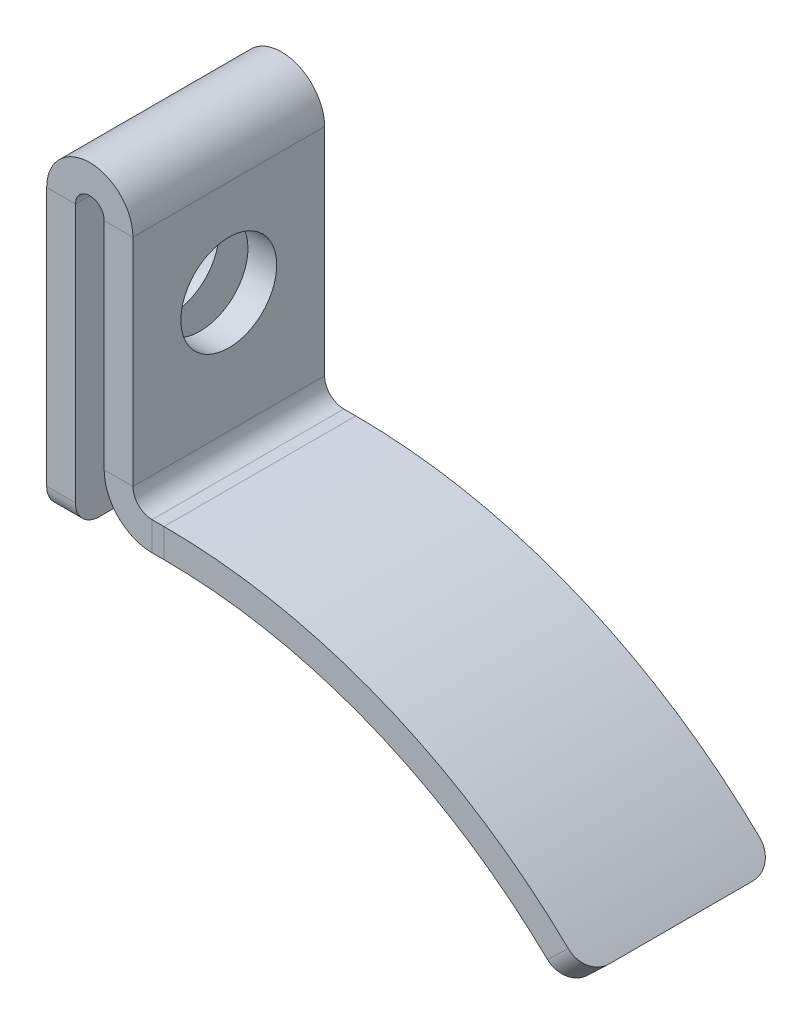
ISO-10303-21;
HEADER;
FILE_DESCRIPTION(('STEP AP214'),'2;1');
FILE_NAME('part.step','',(''),(''),'','','');
FILE_SCHEMA(('AUTOMOTIVE_DESIGN { 1 0 10303 214 1 1 1 1 }'));
ENDSEC;
DATA;
#1=APPLICATION_CONTEXT('core data for automotive mechanical design processes');
#2=APPLICATION_PROTOCOL_DEFINITION('international standard','automotive_design',2000,#1);
#3=PRODUCT_CONTEXT('',#1,'mechanical');
#4=PRODUCT('Part','Part','',(#3));
#5=PRODUCT_RELATED_PRODUCT_CATEGORY('part','',(#4));
#6=PRODUCT_DEFINITION_FORMATION('','',#4);
#7=PRODUCT_DEFINITION_CONTEXT('part definition',#1,'design');
#8=PRODUCT_DEFINITION('design','',#6,#7);
#9=PRODUCT_DEFINITION_SHAPE('','',#8);
#10=(LENGTH_UNIT() NAMED_UNIT(*) SI_UNIT(.MILLI.,.METRE.));
#11=(NAMED_UNIT(*) PLANE_ANGLE_UNIT() SI_UNIT($,.RADIAN.));
#12=(NAMED_UNIT(*) SI_UNIT($,.STERADIAN.) SOLID_ANGLE_UNIT());
#13=UNCERTAINTY_MEASURE_WITH_UNIT(LENGTH_MEASURE(1.E-05),#10,'distance_accuracy_value','');
#14=(GEOMETRIC_REPRESENTATION_CONTEXT(3) GLOBAL_UNCERTAINTY_ASSIGNED_CONTEXT((#13)) GLOBAL_UNIT_ASSIGNED_CONTEXT((#10,
#11,#12)) REPRESENTATION_CONTEXT('',''));
#15=CARTESIAN_POINT('',(0.,0.,0.));
#16=DIRECTION('',(0.,0.,1.));
#17=DIRECTION('',(1.,0.,0.));
#18=AXIS2_PLACEMENT_3D('',#15,#16,#17);
#19=CARTESIAN_POINT('',(1.03626532347582,28.1713062928466,0.85106392317462));
#20=DIRECTION('',(0.,0.,1.));
#21=DIRECTION('',(1.,0.,0.));
#22=AXIS2_PLACEMENT_3D('',#19,#20,#21);
#23=PLANE('',#22);
#24=DIRECTION('',(-1.,0.,0.));
#25=VECTOR('',#24,1.);
#26=CARTESIAN_POINT('',(1.03626532347582,28.1713062928466,0.85106392317462));
#27=LINE('',#26,#25);
#28=CARTESIAN_POINT('',(1.03626532347582,28.1713062928466,0.85106392317462));
#29=VERTEX_POINT('',#28);
#30=CARTESIAN_POINT('',(0.780946174539651,28.1713062928466,0.85106392317462));
#31=VERTEX_POINT('',#30);
#32=EDGE_CURVE('E173',#29,#31,#27,.T.);
#33=ORIENTED_EDGE('',*,*,#32,.F.);
#34=CARTESIAN_POINT('',(1.16392489794391,28.1713062928466,0.85106392317462));
#35=DIRECTION('',(0.,0.,1.));
#36=DIRECTION('',(-1.,0.,0.));
#37=AXIS2_PLACEMENT_3D('',#34,#35,#36);
#38=CIRCLE('',#37,0.127659574468085);
#39=CARTESIAN_POINT('',(1.29158447241199,28.1713062928466,0.85106392317462));
#40=VERTEX_POINT('',#39);
#41=EDGE_CURVE('E176',#40,#29,#38,.T.);
#42=ORIENTED_EDGE('',*,*,#41,.F.);
#43=DIRECTION('',(-1.,0.,0.));
#44=VECTOR('',#43,1.);
#45=CARTESIAN_POINT('',(1.54690362134816,28.1713062928466,0.85106392317462));
#46=LINE('',#45,#44);
#47=CARTESIAN_POINT('',(1.54690362134816,28.1713062928466,0.85106392317462));
#48=VERTEX_POINT('',#47);
#49=EDGE_CURVE('E182',#48,#40,#46,.T.);
#50=ORIENTED_EDGE('',*,*,#49,.F.);
#51=CARTESIAN_POINT('',(1.16392489794391,28.1713062928466,0.85106392317462));
#52=DIRECTION('',(0.,0.,1.));
#53=DIRECTION('',(1.,0.,0.));
#54=AXIS2_PLACEMENT_3D('',#51,#52,#53);
#55=CIRCLE('',#54,0.382978723404255);
#56=EDGE_CURVE('E179',#48,#31,#55,.T.);
#57=ORIENTED_EDGE('',*,*,#56,.T.);
#58=EDGE_LOOP('',(#33,#42,#50,#57));
#59=FACE_BOUND('',#58,.T.);
#60=ADVANCED_FACE('F43',(#59),#23,.T.);
#61=CARTESIAN_POINT('',(1.54690362134816,28.1713062928466,0.85106392317462));
#62=DIRECTION('',(0.,0.,1.));
#63=DIRECTION('',(1.,0.,0.));
#64=AXIS2_PLACEMENT_3D('',#61,#62,#63);
#65=PLANE('',#64);
#66=DIRECTION('',(0.,-1.,0.));
#67=VECTOR('',#66,1.);
#68=CARTESIAN_POINT('',(0.780946174539651,28.1713062928466,0.85106392317462));
#69=LINE('',#68,#67);
#70=CARTESIAN_POINT('',(0.780946174539651,25.8731110371542,0.85106392317462));
#71=VERTEX_POINT('',#70);
#72=EDGE_CURVE('E197',#31,#71,#69,.T.);
#73=ORIENTED_EDGE('',*,*,#72,.T.);
#74=DIRECTION('',(-1.,0.,0.));
#75=VECTOR('',#74,1.);
#76=CARTESIAN_POINT('',(1.54690362134816,25.8731110371542,0.85106392317462));
#77=LINE('',#76,#75);
#78=CARTESIAN_POINT('',(1.03626532347582,25.8731110371542,0.85106392317462));
#79=VERTEX_POINT('',#78);
#80=EDGE_CURVE('E67',#71,#79,#77,.F.);
#81=ORIENTED_EDGE('',*,*,#80,.T.);
#82=DIRECTION('',(0.,-1.,0.));
#83=VECTOR('',#82,1.);
#84=CARTESIAN_POINT('',(1.03626532347582,28.1713062928466,0.85106392317462));
#85=LINE('',#84,#83);
#86=EDGE_CURVE('E187',#29,#79,#85,.T.);
#87=ORIENTED_EDGE('',*,*,#86,.F.);
#88=ORIENTED_EDGE('',*,*,#32,.T.);
#89=EDGE_LOOP('',(#73,#81,#87,#88));
#90=FACE_BOUND('',#89,.T.);
#91=ADVANCED_FACE('F196',(#90),#65,.T.);
#92=CARTESIAN_POINT('',(1.29158447241199,28.1713062928466,-0.851063736399848));
#93=DIRECTION('',(0.,0.,-1.));
#94=DIRECTION('',(-1.,0.,0.));
#95=AXIS2_PLACEMENT_3D('',#92,#93,#94);
#96=PLANE('',#95);
#97=DIRECTION('',(1.,0.,0.));
#98=VECTOR('',#97,1.);
#99=CARTESIAN_POINT('',(1.29158447241199,28.1713062928466,-0.851063736399848));
#100=LINE('',#99,#98);
#101=CARTESIAN_POINT('',(1.29158447241199,28.1713062928466,-0.851063736399848));
#102=VERTEX_POINT('',#101);
#103=CARTESIAN_POINT('',(1.54690362134816,28.1713062928466,-0.851063736399848));
#104=VERTEX_POINT('',#103);
#105=EDGE_CURVE('E310',#102,#104,#100,.T.);
#106=ORIENTED_EDGE('',*,*,#105,.F.);
#107=CARTESIAN_POINT('',(1.16392489794391,28.1713062928466,-0.851063736399848));
#108=DIRECTION('',(0.,0.,1.));
#109=DIRECTION('',(-1.,0.,0.));
#110=AXIS2_PLACEMENT_3D('',#107,#108,#109);
#111=CIRCLE('',#110,0.127659574468085);
#112=CARTESIAN_POINT('',(1.03626532347582,28.1713062928466,-0.851063736399848));
#113=VERTEX_POINT('',#112);
#114=EDGE_CURVE('E233',#102,#113,#111,.T.);
#115=ORIENTED_EDGE('',*,*,#114,.T.);
#116=DIRECTION('',(1.,0.,0.));
#117=VECTOR('',#116,1.);
#118=CARTESIAN_POINT('',(0.780946174539651,28.1713062928466,-0.851063736399848));
#119=LINE('',#118,#117);
#120=CARTESIAN_POINT('',(0.780946174539651,28.1713062928466,-0.851063736399848));
#121=VERTEX_POINT('',#120);
#122=EDGE_CURVE('E308',#121,#113,#119,.T.);
#123=ORIENTED_EDGE('',*,*,#122,.F.);
#124=CARTESIAN_POINT('',(1.16392489794391,28.1713062928466,-0.851063736399848));
#125=DIRECTION('',(0.,0.,1.));
#126=DIRECTION('',(1.,0.,0.));
#127=AXIS2_PLACEMENT_3D('',#124,#125,#126);
#128=CIRCLE('',#127,0.382978723404255);
#129=EDGE_CURVE('E257',#104,#121,#128,.T.);
#130=ORIENTED_EDGE('',*,*,#129,.F.);
#131=EDGE_LOOP('',(#106,#115,#123,#130));
#132=FACE_BOUND('',#131,.T.);
#133=ADVANCED_FACE('F379',(#132),#96,.T.);
#134=CARTESIAN_POINT('',(0.780946174539651,28.1713062928466,-0.851063736399848));
#135=DIRECTION('',(0.,0.,-1.));
#136=DIRECTION('',(-1.,0.,0.));
#137=AXIS2_PLACEMENT_3D('',#134,#135,#136);
#138=PLANE('',#137);
#139=DIRECTION('',(0.,1.,0.));
#140=VECTOR('',#139,1.);
#141=CARTESIAN_POINT('',(1.29158447241199,28.1713062928466,-0.851063736399848));
#142=LINE('',#141,#140);
#143=CARTESIAN_POINT('',(1.29158447241199,26.2547036106091,-0.851063736399848));
#144=VERTEX_POINT('',#143);
#145=EDGE_CURVE('E235',#144,#102,#142,.T.);
#146=ORIENTED_EDGE('',*,*,#145,.T.);
#147=ORIENTED_EDGE('',*,*,#105,.T.);
#148=DIRECTION('',(0.,1.,0.));
#149=VECTOR('',#148,1.);
#150=CARTESIAN_POINT('',(1.54690362134816,28.1713062928466,-0.851063736399848));
#151=LINE('',#150,#149);
#152=CARTESIAN_POINT('',(1.54690362134816,26.2547036106091,-0.851063736399848));
#153=VERTEX_POINT('',#152);
#154=EDGE_CURVE('E254',#153,#104,#151,.T.);
#155=ORIENTED_EDGE('',*,*,#154,.F.);
#156=DIRECTION('',(-1.,0.,0.));
#157=VECTOR('',#156,1.);
#158=CARTESIAN_POINT('',(1.54690362134816,26.2547036106091,-0.851063736399848));
#159=LINE('',#158,#157);
#160=EDGE_CURVE('E300',#153,#144,#159,.T.);
#161=ORIENTED_EDGE('',*,*,#160,.T.);
#162=EDGE_LOOP('',(#146,#147,#155,#161));
#163=FACE_BOUND('',#162,.T.);
#164=ADVANCED_FACE('F384',(#163),#138,.T.);
#165=CARTESIAN_POINT('',(1.29158447241199,26.2547036106091,0.85106392317462));
#166=DIRECTION('',(0.,0.,1.));
#167=DIRECTION('',(1.,0.,0.));
#168=AXIS2_PLACEMENT_3D('',#165,#166,#167);
#169=PLANE('',#168);
#170=DIRECTION('',(1.,0.,0.));
#171=VECTOR('',#170,1.);
#172=CARTESIAN_POINT('',(1.29158447241199,26.2547036106091,0.85106392317462));
#173=LINE('',#172,#171);
#174=CARTESIAN_POINT('',(1.29158447241199,26.2547036106091,0.85106392317462));
#175=VERTEX_POINT('',#174);
#176=CARTESIAN_POINT('',(1.54690362134816,26.2547036106091,0.85106392317462));
#177=VERTEX_POINT('',#176);
#178=EDGE_CURVE('E306',#175,#177,#173,.T.);
#179=ORIENTED_EDGE('',*,*,#178,.F.);
#180=CARTESIAN_POINT('',(1.71711638730561,26.2547036106091,0.85106392317462));
#181=DIRECTION('',(0.,0.,-1.));
#182=DIRECTION('',(-1.,0.,0.));
#183=AXIS2_PLACEMENT_3D('',#180,#181,#182);
#184=CIRCLE('',#183,0.425531914893617);
#185=CARTESIAN_POINT('',(1.71711638730561,25.8291716957155,0.85106392317462));
#186=VERTEX_POINT('',#185);
#187=EDGE_CURVE('E204',#186,#175,#184,.T.);
#188=ORIENTED_EDGE('',*,*,#187,.F.);
#189=DIRECTION('',(0.,-1.,0.));
#190=VECTOR('',#189,1.);
#191=CARTESIAN_POINT('',(1.71711638730561,26.0844908446516,0.85106392317462));
#192=LINE('',#191,#190);
#193=CARTESIAN_POINT('',(1.71711638730561,26.0844908446516,0.85106392317462));
#194=VERTEX_POINT('',#193);
#195=EDGE_CURVE('E304',#194,#186,#192,.T.);
#196=ORIENTED_EDGE('',*,*,#195,.F.);
#197=CARTESIAN_POINT('',(1.71711638730561,26.2547036106091,0.85106392317462));
#198=DIRECTION('',(0.,0.,1.));
#199=DIRECTION('',(1.,0.,0.));
#200=AXIS2_PLACEMENT_3D('',#197,#198,#199);
#201=CIRCLE('',#200,0.170212765957447);
#202=EDGE_CURVE('E220',#194,#177,#201,.F.);
#203=ORIENTED_EDGE('',*,*,#202,.T.);
#204=EDGE_LOOP('',(#179,#188,#196,#203));
#205=FACE_BOUND('',#204,.T.);
#206=ADVANCED_FACE('F388',(#205),#169,.T.);
#207=CARTESIAN_POINT('',(1.71711638730561,26.0844908446516,0.85106392317462));
#208=DIRECTION('',(0.,0.,1.));
#209=DIRECTION('',(1.,0.,0.));
#210=AXIS2_PLACEMENT_3D('',#207,#208,#209);
#211=PLANE('',#210);
#212=DIRECTION('',(0.,1.,0.));
#213=VECTOR('',#212,1.);
#214=CARTESIAN_POINT('',(1.29158447241199,28.1713062928466,0.85106392317462));
#215=LINE('',#214,#213);
#216=EDGE_CURVE('E202',#175,#40,#215,.T.);
#217=ORIENTED_EDGE('',*,*,#216,.F.);
#218=ORIENTED_EDGE('',*,*,#178,.T.);
#219=DIRECTION('',(0.,1.,0.));
#220=VECTOR('',#219,1.);
#221=CARTESIAN_POINT('',(1.54690362134816,28.1713062928466,0.85106392317462));
#222=LINE('',#221,#220);
#223=EDGE_CURVE('E223',#177,#48,#222,.T.);
#224=ORIENTED_EDGE('',*,*,#223,.T.);
#225=ORIENTED_EDGE('',*,*,#49,.T.);
#226=EDGE_LOOP('',(#217,#218,#224,#225));
#227=FACE_BOUND('',#226,.T.);
#228=ADVANCED_FACE('F392',(#227),#211,.T.);
#229=CARTESIAN_POINT('',(1.71711638730561,25.8291716957155,-0.851063736399848));
#230=DIRECTION('',(0.,0.,-1.));
#231=DIRECTION('',(-1.,0.,0.));
#232=AXIS2_PLACEMENT_3D('',#229,#230,#231);
#233=PLANE('',#232);
#234=DIRECTION('',(0.,1.,0.));
#235=VECTOR('',#234,1.);
#236=CARTESIAN_POINT('',(1.71711638730561,25.8291716957155,-0.851063736399848));
#237=LINE('',#236,#235);
#238=CARTESIAN_POINT('',(1.71711638730561,25.8291716957155,-0.851063736399848));
#239=VERTEX_POINT('',#238);
#240=CARTESIAN_POINT('',(1.71711638730561,26.0844908446516,-0.851063736399848));
#241=VERTEX_POINT('',#240);
#242=EDGE_CURVE('E302',#239,#241,#237,.T.);
#243=ORIENTED_EDGE('',*,*,#242,.F.);
#244=CARTESIAN_POINT('',(1.71711638730561,26.2547036106091,-0.851063736399848));
#245=DIRECTION('',(0.,0.,-1.));
#246=DIRECTION('',(-1.,0.,0.));
#247=AXIS2_PLACEMENT_3D('',#244,#245,#246);
#248=CIRCLE('',#247,0.425531914893617);
#249=EDGE_CURVE('E238',#239,#144,#248,.T.);
#250=ORIENTED_EDGE('',*,*,#249,.T.);
#251=ORIENTED_EDGE('',*,*,#160,.F.);
#252=CARTESIAN_POINT('',(1.71711638730561,26.2547036106091,-0.851063736399848));
#253=DIRECTION('',(0.,0.,1.));
#254=DIRECTION('',(1.,0.,0.));
#255=AXIS2_PLACEMENT_3D('',#252,#253,#254);
#256=CIRCLE('',#255,0.170212765957447);
#257=EDGE_CURVE('E251',#241,#153,#256,.F.);
#258=ORIENTED_EDGE('',*,*,#257,.F.);
#259=EDGE_LOOP('',(#243,#250,#251,#258));
#260=FACE_BOUND('',#259,.T.);
#261=ADVANCED_FACE('F396',(#260),#233,.T.);
#262=CARTESIAN_POINT('',(1.54690362134816,26.2547036106091,-0.851063736399848));
#263=DIRECTION('',(0.,0.,-1.));
#264=DIRECTION('',(-1.,0.,0.));
#265=AXIS2_PLACEMENT_3D('',#262,#263,#264);
#266=PLANE('',#265);
#267=DIRECTION('',(-1.,0.,0.));
#268=VECTOR('',#267,1.);
#269=CARTESIAN_POINT('',(1.71711638730561,25.8291716957155,-0.851063736399848));
#270=LINE('',#269,#268);
#271=CARTESIAN_POINT('',(1.82349936602901,25.8291716957155,-0.851063736399848));
#272=VERTEX_POINT('',#271);
#273=EDGE_CURVE('E241',#272,#239,#270,.T.);
#274=ORIENTED_EDGE('',*,*,#273,.T.);
#275=ORIENTED_EDGE('',*,*,#242,.T.);
#276=DIRECTION('',(-1.,0.,0.));
#277=VECTOR('',#276,1.);
#278=CARTESIAN_POINT('',(1.71711638730561,26.0844908446516,-0.851063736399848));
#279=LINE('',#278,#277);
#280=CARTESIAN_POINT('',(1.82349936602901,26.0844908446516,-0.851063736399848));
#281=VERTEX_POINT('',#280);
#282=EDGE_CURVE('E248',#281,#241,#279,.T.);
#283=ORIENTED_EDGE('',*,*,#282,.F.);
#284=DIRECTION('',(0.,-1.,0.));
#285=VECTOR('',#284,1.);
#286=CARTESIAN_POINT('',(1.82349936602901,26.0844908446516,-0.851063736399848));
#287=LINE('',#286,#285);
#288=EDGE_CURVE('E294',#281,#272,#287,.T.);
#289=ORIENTED_EDGE('',*,*,#288,.T.);
#290=EDGE_LOOP('',(#274,#275,#283,#289));
#291=FACE_BOUND('',#290,.T.);
#292=ADVANCED_FACE('F400',(#291),#266,.T.);
#293=CARTESIAN_POINT('',(1.82349936602901,25.8291716957155,0.85106392317462));
#294=DIRECTION('',(0.,0.,1.));
#295=DIRECTION('',(1.,0.,0.));
#296=AXIS2_PLACEMENT_3D('',#293,#294,#295);
#297=PLANE('',#296);
#298=CARTESIAN_POINT('',(1.82349936602901,20.9186812399091,0.85106392317462));
#299=DIRECTION('',(0.,0.,1.));
#300=DIRECTION('',(1.,0.,0.));
#301=AXIS2_PLACEMENT_3D('',#298,#299,#300);
#302=CIRCLE('',#301,4.91049045580632);
#303=CARTESIAN_POINT('',(5.22750436467205,24.4578430737023,0.85106392317462));
#304=VERTEX_POINT('',#303);
#305=CARTESIAN_POINT('',(1.82349936602901,25.8291716957155,0.85106392317462));
#306=VERTEX_POINT('',#305);
#307=EDGE_CURVE('E213',#304,#306,#302,.T.);
#308=ORIENTED_EDGE('',*,*,#307,.F.);
#309=DIRECTION('',(-0.723788398978082,-0.69002199494273,0.));
#310=VECTOR('',#309,1.);
#311=CARTESIAN_POINT('',(4.1291320064655,23.4107123282113,0.85106392317462));
#312=LINE('',#311,#310);
#313=CARTESIAN_POINT('',(5.41246651837662,24.6341763148379,0.85106392317462));
#314=VERTEX_POINT('',#313);
#315=EDGE_CURVE('E771',#304,#314,#312,.F.);
#316=ORIENTED_EDGE('',*,*,#315,.T.);
#317=CARTESIAN_POINT('',(1.82349936602901,20.9186812399091,0.85106392317462));
#318=DIRECTION('',(0.,0.,1.));
#319=DIRECTION('',(1.,0.,0.));
#320=AXIS2_PLACEMENT_3D('',#317,#318,#319);
#321=CIRCLE('',#320,5.16580960474249);
#322=CARTESIAN_POINT('',(1.82349936602901,26.0844908446516,0.85106392317462));
#323=VERTEX_POINT('',#322);
#324=EDGE_CURVE('E215',#314,#323,#321,.T.);
#325=ORIENTED_EDGE('',*,*,#324,.T.);
#326=DIRECTION('',(0.,1.,0.));
#327=VECTOR('',#326,1.);
#328=CARTESIAN_POINT('',(1.82349936602901,25.8291716957155,0.85106392317462));
#329=LINE('',#328,#327);
#330=EDGE_CURVE('E297',#306,#323,#329,.T.);
#331=ORIENTED_EDGE('',*,*,#330,.F.);
#332=EDGE_LOOP('',(#308,#316,#325,#331));
#333=FACE_BOUND('',#332,.T.);
#334=ADVANCED_FACE('F404',(#333),#297,.T.);
#335=CARTESIAN_POINT('',(1.82349936602901,26.0844908446516,-0.851063736399848));
#336=DIRECTION('',(0.,0.,-1.));
#337=DIRECTION('',(-1.,0.,0.));
#338=AXIS2_PLACEMENT_3D('',#335,#336,#337);
#339=PLANE('',#338);
#340=CARTESIAN_POINT('',(1.82349936602901,20.9186812399091,-0.851063736399848));
#341=DIRECTION('',(0.,0.,1.));
#342=DIRECTION('',(1.,0.,0.));
#343=AXIS2_PLACEMENT_3D('',#340,#341,#342);
#344=CIRCLE('',#343,5.16580960474249);
#345=CARTESIAN_POINT('',(5.41246651837662,24.6341763148379,-0.851063736399848));
#346=VERTEX_POINT('',#345);
#347=EDGE_CURVE('E246',#346,#281,#344,.T.);
#348=ORIENTED_EDGE('',*,*,#347,.F.);
#349=DIRECTION('',(-0.723788398978082,-0.69002199494273,0.));
#350=VECTOR('',#349,1.);
#351=CARTESIAN_POINT('',(4.25664602731126,23.5322775248508,-0.851063736399848));
#352=LINE('',#351,#350);
#353=CARTESIAN_POINT('',(5.22750436467205,24.4578430737023,-0.851063736399848));
#354=VERTEX_POINT('',#353);
#355=EDGE_CURVE('E181',#346,#354,#352,.T.);
#356=ORIENTED_EDGE('',*,*,#355,.T.);
#357=CARTESIAN_POINT('',(1.82349936602901,20.9186812399091,-0.851063736399848));
#358=DIRECTION('',(0.,0.,1.));
#359=DIRECTION('',(1.,0.,0.));
#360=AXIS2_PLACEMENT_3D('',#357,#358,#359);
#361=CIRCLE('',#360,4.91049045580632);
#362=EDGE_CURVE('E244',#354,#272,#361,.T.);
#363=ORIENTED_EDGE('',*,*,#362,.T.);
#364=ORIENTED_EDGE('',*,*,#288,.F.);
#365=EDGE_LOOP('',(#348,#356,#363,#364));
#366=FACE_BOUND('',#365,.T.);
#367=ADVANCED_FACE('F408',(#366),#339,.T.);
#368=CARTESIAN_POINT('',(0.780946174539651,28.1713062928466,0.85106392317462));
#369=DIRECTION('',(1.,0.,0.));
#370=DIRECTION('',(0.,1.,0.));
#371=AXIS2_PLACEMENT_3D('',#368,#369,#370);
#372=PLANE('',#371);
#373=CARTESIAN_POINT('',(0.78094617453965,27.3202424630594,9.33873860160669E-08));
#374=DIRECTION('',(1.,0.,0.));
#375=DIRECTION('',(0.,0.,-1.));
#376=AXIS2_PLACEMENT_3D('',#373,#374,#375);
#377=CIRCLE('',#376,0.425531914893617);
#378=CARTESIAN_POINT('',(0.78094617453965,27.3202424630594,-0.425531821506231));
#379=VERTEX_POINT('',#378);
#380=EDGE_CURVE('E487',#379,#379,#377,.T.);
#381=ORIENTED_EDGE('',*,*,#380,.T.);
#382=EDGE_LOOP('',(#381));
#383=FACE_BOUND('',#382,.T.);
#384=DIRECTION('',(0.,0.,-1.));
#385=VECTOR('',#384,1.);
#386=CARTESIAN_POINT('',(0.780946174539651,25.6603450797074,0.85106392317462));
#387=LINE('',#386,#385);
#388=CARTESIAN_POINT('',(0.780946174539651,25.6603450797074,0.638297965727812));
#389=VERTEX_POINT('',#388);
#390=CARTESIAN_POINT('',(0.780946174539651,25.6603450797074,-0.638297778953039));
#391=VERTEX_POINT('',#390);
#392=EDGE_CURVE('E291',#389,#391,#387,.T.);
#393=ORIENTED_EDGE('',*,*,#392,.F.);
#394=CARTESIAN_POINT('',(0.780946174539651,25.8731110371542,0.638297965727812));
#395=DIRECTION('',(1.,0.,0.));
#396=DIRECTION('',(0.,1.,0.));
#397=AXIS2_PLACEMENT_3D('',#394,#395,#396);
#398=CIRCLE('',#397,0.212765957446809);
#399=EDGE_CURVE('E480',#389,#71,#398,.F.);
#400=ORIENTED_EDGE('',*,*,#399,.T.);
#401=ORIENTED_EDGE('',*,*,#72,.F.);
#402=DIRECTION('',(0.,0.,-1.));
#403=VECTOR('',#402,1.);
#404=CARTESIAN_POINT('',(0.780946174539651,28.1713062928466,0.85106392317462));
#405=LINE('',#404,#403);
#406=EDGE_CURVE('E227',#31,#121,#405,.T.);
#407=ORIENTED_EDGE('',*,*,#406,.T.);
#408=DIRECTION('',(0.,-1.,0.));
#409=VECTOR('',#408,1.);
#410=CARTESIAN_POINT('',(0.780946174539651,28.1713062928466,-0.851063736399848));
#411=LINE('',#410,#409);
#412=CARTESIAN_POINT('',(0.780946174539651,25.8731110371542,-0.851063736399848));
#413=VERTEX_POINT('',#412);
#414=EDGE_CURVE('E228',#121,#413,#411,.T.);
#415=ORIENTED_EDGE('',*,*,#414,.T.);
#416=CARTESIAN_POINT('',(0.780946174539651,25.8731110371542,-0.638297778953039));
#417=DIRECTION('',(1.,0.,0.));
#418=DIRECTION('',(0.,1.,0.));
#419=AXIS2_PLACEMENT_3D('',#416,#417,#418);
#420=CIRCLE('',#419,0.212765957446809);
#421=EDGE_CURVE('E767',#413,#391,#420,.F.);
#422=ORIENTED_EDGE('',*,*,#421,.T.);
#423=EDGE_LOOP('',(#393,#400,#401,#407,#415,#422));
#424=FACE_BOUND('',#423,.T.);
#425=ADVANCED_FACE('F412',(#383,#424),#372,.F.);
#426=CARTESIAN_POINT('',(1.03626532347582,25.6603450797074,0.85106392317462));
#427=DIRECTION('',(0.,-1.,0.));
#428=DIRECTION('',(0.,0.,-1.));
#429=AXIS2_PLACEMENT_3D('',#426,#427,#428);
#430=PLANE('',#429);
#431=DIRECTION('',(0.,0.,-1.));
#432=VECTOR('',#431,1.);
#433=CARTESIAN_POINT('',(1.03626532347582,25.6603450797074,0.85106392317462));
#434=LINE('',#433,#432);
#435=CARTESIAN_POINT('',(1.03626532347582,25.6603450797074,0.638297965727812));
#436=VERTEX_POINT('',#435);
#437=CARTESIAN_POINT('',(1.03626532347582,25.6603450797074,-0.638297778953039));
#438=VERTEX_POINT('',#437);
#439=EDGE_CURVE('E193',#436,#438,#434,.T.);
#440=ORIENTED_EDGE('',*,*,#439,.F.);
#441=DIRECTION('',(-1.,0.,0.));
#442=VECTOR('',#441,1.);
#443=CARTESIAN_POINT('',(1.03626532347582,25.6603450797074,0.638297965727812));
#444=LINE('',#443,#442);
#445=EDGE_CURVE('E760',#436,#389,#444,.T.);
#446=ORIENTED_EDGE('',*,*,#445,.T.);
#447=ORIENTED_EDGE('',*,*,#392,.T.);
#448=DIRECTION('',(-1.,0.,0.));
#449=VECTOR('',#448,1.);
#450=CARTESIAN_POINT('',(1.03626532347582,25.6603450797074,-0.638297778953039));
#451=LINE('',#450,#449);
#452=EDGE_CURVE('E770',#391,#438,#451,.F.);
#453=ORIENTED_EDGE('',*,*,#452,.T.);
#454=EDGE_LOOP('',(#440,#446,#447,#453));
#455=FACE_BOUND('',#454,.T.);
#456=ADVANCED_FACE('F416',(#455),#430,.T.);
#457=CARTESIAN_POINT('',(1.03626532347582,28.1713062928466,0.85106392317462));
#458=DIRECTION('',(1.,0.,0.));
#459=DIRECTION('',(0.,1.,0.));
#460=AXIS2_PLACEMENT_3D('',#457,#458,#459);
#461=PLANE('',#460);
#462=CARTESIAN_POINT('',(1.03626532347582,27.3202424630594,9.33873860160669E-08));
#463=DIRECTION('',(1.,0.,0.));
#464=DIRECTION('',(0.,1.,0.));
#465=AXIS2_PLACEMENT_3D('',#462,#463,#464);
#466=CIRCLE('',#465,0.425531914893617);
#467=CARTESIAN_POINT('',(1.03626532347582,27.745774377953,9.33873860160669E-08));
#468=VERTEX_POINT('',#467);
#469=EDGE_CURVE('E231',#468,#468,#466,.T.);
#470=ORIENTED_EDGE('',*,*,#469,.F.);
#471=EDGE_LOOP('',(#470));
#472=FACE_BOUND('',#471,.T.);
#473=ORIENTED_EDGE('',*,*,#86,.T.);
#474=CARTESIAN_POINT('',(1.03626532347582,25.8731110371542,0.638297965727812));
#475=DIRECTION('',(1.,0.,0.));
#476=DIRECTION('',(0.,1.,0.));
#477=AXIS2_PLACEMENT_3D('',#474,#475,#476);
#478=CIRCLE('',#477,0.212765957446809);
#479=EDGE_CURVE('E52',#79,#436,#478,.T.);
#480=ORIENTED_EDGE('',*,*,#479,.T.);
#481=ORIENTED_EDGE('',*,*,#439,.T.);
#482=CARTESIAN_POINT('',(1.03626532347582,25.8731110371542,-0.638297778953039));
#483=DIRECTION('',(1.,0.,0.));
#484=DIRECTION('',(0.,1.,0.));
#485=AXIS2_PLACEMENT_3D('',#482,#483,#484);
#486=CIRCLE('',#485,0.212765957446809);
#487=CARTESIAN_POINT('',(1.03626532347582,25.8731110371542,-0.851063736399848));
#488=VERTEX_POINT('',#487);
#489=EDGE_CURVE('E59',#438,#488,#486,.T.);
#490=ORIENTED_EDGE('',*,*,#489,.T.);
#491=DIRECTION('',(0.,-1.,0.));
#492=VECTOR('',#491,1.);
#493=CARTESIAN_POINT('',(1.03626532347582,28.1713062928466,-0.851063736399848));
#494=LINE('',#493,#492);
#495=EDGE_CURVE('E189',#113,#488,#494,.T.);
#496=ORIENTED_EDGE('',*,*,#495,.F.);
#497=DIRECTION('',(0.,0.,-1.));
#498=VECTOR('',#497,1.);
#499=CARTESIAN_POINT('',(1.03626532347582,28.1713062928466,0.85106392317462));
#500=LINE('',#499,#498);
#501=EDGE_CURVE('E185',#29,#113,#500,.T.);
#502=ORIENTED_EDGE('',*,*,#501,.F.);
#503=EDGE_LOOP('',(#473,#480,#481,#490,#496,#502));
#504=FACE_BOUND('',#503,.T.);
#505=ADVANCED_FACE('F186',(#472,#504),#461,.T.);
#506=CARTESIAN_POINT('',(1.16392489794391,28.1713062928466,0.85106392317462));
#507=DIRECTION('',(0.,0.,-1.));
#508=DIRECTION('',(-1.,0.,0.));
#509=AXIS2_PLACEMENT_3D('',#506,#507,#508);
#510=CYLINDRICAL_SURFACE('',#509,0.127659574468085);
#511=ORIENTED_EDGE('',*,*,#114,.F.);
#512=DIRECTION('',(0.,0.,-1.));
#513=VECTOR('',#512,1.);
#514=CARTESIAN_POINT('',(1.29158447241199,28.1713062928466,0.85106392317462));
#515=LINE('',#514,#513);
#516=EDGE_CURVE('E194',#40,#102,#515,.T.);
#517=ORIENTED_EDGE('',*,*,#516,.F.);
#518=ORIENTED_EDGE('',*,*,#41,.T.);
#519=ORIENTED_EDGE('',*,*,#501,.T.);
#520=EDGE_LOOP('',(#511,#517,#518,#519));
#521=FACE_BOUND('',#520,.T.);
#522=ADVANCED_FACE('F200',(#521),#510,.F.);
#523=CARTESIAN_POINT('',(1.29158447241199,28.1713062928466,0.85106392317462));
#524=DIRECTION('',(-1.,0.,0.));
#525=DIRECTION('',(0.,-1.,0.));
#526=AXIS2_PLACEMENT_3D('',#523,#524,#525);
#527=PLANE('',#526);
#528=CARTESIAN_POINT('',(1.29158447241199,27.3202424630594,9.33873860160669E-08));
#529=DIRECTION('',(-1.,0.,0.));
#530=DIRECTION('',(0.,-1.,0.));
#531=AXIS2_PLACEMENT_3D('',#528,#529,#530);
#532=CIRCLE('',#531,0.425531914893617);
#533=CARTESIAN_POINT('',(1.29158447241199,26.8947105481658,9.33873860160669E-08));
#534=VERTEX_POINT('',#533);
#535=EDGE_CURVE('E484',#534,#534,#532,.T.);
#536=ORIENTED_EDGE('',*,*,#535,.F.);
#537=EDGE_LOOP('',(#536));
#538=FACE_BOUND('',#537,.T.);
#539=ORIENTED_EDGE('',*,*,#145,.F.);
#540=DIRECTION('',(0.,0.,-1.));
#541=VECTOR('',#540,1.);
#542=CARTESIAN_POINT('',(1.29158447241199,26.2547036106091,0.85106392317462));
#543=LINE('',#542,#541);
#544=EDGE_CURVE('E286',#175,#144,#543,.T.);
#545=ORIENTED_EDGE('',*,*,#544,.F.);
#546=ORIENTED_EDGE('',*,*,#216,.T.);
#547=ORIENTED_EDGE('',*,*,#516,.T.);
#548=EDGE_LOOP('',(#539,#545,#546,#547));
#549=FACE_BOUND('',#548,.T.);
#550=ADVANCED_FACE('F426',(#538,#549),#527,.T.);
#551=CARTESIAN_POINT('',(1.71711638730561,26.2547036106091,0.85106392317462));
#552=DIRECTION('',(0.,0.,-1.));
#553=DIRECTION('',(-1.,0.,0.));
#554=AXIS2_PLACEMENT_3D('',#551,#552,#553);
#555=CYLINDRICAL_SURFACE('',#554,0.425531914893617);
#556=ORIENTED_EDGE('',*,*,#249,.F.);
#557=DIRECTION('',(0.,0.,-1.));
#558=VECTOR('',#557,1.);
#559=CARTESIAN_POINT('',(1.71711638730561,25.8291716957155,0.85106392317462));
#560=LINE('',#559,#558);
#561=EDGE_CURVE('E283',#186,#239,#560,.T.);
#562=ORIENTED_EDGE('',*,*,#561,.F.);
#563=ORIENTED_EDGE('',*,*,#187,.T.);
#564=ORIENTED_EDGE('',*,*,#544,.T.);
#565=EDGE_LOOP('',(#556,#562,#563,#564));
#566=FACE_BOUND('',#565,.T.);
#567=ADVANCED_FACE('F429',(#566),#555,.T.);
#568=CARTESIAN_POINT('',(1.71711638730561,25.8291716957155,0.85106392317462));
#569=DIRECTION('',(0.,-1.,0.));
#570=DIRECTION('',(1.,0.,0.));
#571=AXIS2_PLACEMENT_3D('',#568,#569,#570);
#572=PLANE('',#571);
#573=ORIENTED_EDGE('',*,*,#273,.F.);
#574=DIRECTION('',(0.,0.,-1.));
#575=VECTOR('',#574,1.);
#576=CARTESIAN_POINT('',(1.82349936602901,25.8291716957155,0.85106392317462));
#577=LINE('',#576,#575);
#578=EDGE_CURVE('E280',#306,#272,#577,.T.);
#579=ORIENTED_EDGE('',*,*,#578,.F.);
#580=DIRECTION('',(-1.,0.,0.));
#581=VECTOR('',#580,1.);
#582=CARTESIAN_POINT('',(1.71711638730561,25.8291716957155,0.85106392317462));
#583=LINE('',#582,#581);
#584=EDGE_CURVE('E210',#306,#186,#583,.T.);
#585=ORIENTED_EDGE('',*,*,#584,.T.);
#586=ORIENTED_EDGE('',*,*,#561,.T.);
#587=EDGE_LOOP('',(#573,#579,#585,#586));
#588=FACE_BOUND('',#587,.T.);
#589=ADVANCED_FACE('F373',(#588),#572,.T.);
#590=CARTESIAN_POINT('',(1.82349936602901,20.9186812399091,0.85106392317462));
#591=DIRECTION('',(0.,0.,-1.));
#592=DIRECTION('',(-1.,0.,0.));
#593=AXIS2_PLACEMENT_3D('',#590,#591,#592);
#594=CYLINDRICAL_SURFACE('',#593,4.91049045580632);
#595=ORIENTED_EDGE('',*,*,#362,.F.);
#596=CARTESIAN_POINT('',(5.22750436467205,24.4578430737023,-0.851063736399848));
#597=CARTESIAN_POINT('',(5.23613179685593,24.4495474537987,-0.85107397614292));
#598=CARTESIAN_POINT('',(5.24472457416819,24.4412198379125,-0.850056330824254));
#599=CARTESIAN_POINT('',(5.26160321200444,24.4247464151384,-0.846038623630914));
#600=CARTESIAN_POINT('',(5.26988930369258,24.4166004732336,-0.843040088366938));
#601=CARTESIAN_POINT('',(5.28593504928576,24.400718640214,-0.835131731310018));
#602=CARTESIAN_POINT('',(5.29369443241139,24.3929829604539,-0.830220935038091));
#603=CARTESIAN_POINT('',(5.30847233274722,24.3781594191393,-0.81863111305486));
#604=CARTESIAN_POINT('',(5.31549098723207,24.3710714375836,-0.81195241578542));
#605=CARTESIAN_POINT('',(5.3286005534343,24.3577610083409,-0.797018781680214));
#606=CARTESIAN_POINT('',(5.33469192879676,24.3515381282339,-0.788764637261554));
#607=CARTESIAN_POINT('',(5.34579526542672,24.3401446037267,-0.770910138590138));
#608=CARTESIAN_POINT('',(5.35080701131903,24.3349741692901,-0.761309516358173));
#609=CARTESIAN_POINT('',(5.3596242873093,24.3258468502946,-0.7410329280117));
#610=CARTESIAN_POINT('',(5.36342932229441,24.3218904638806,-0.730356522865354));
#611=CARTESIAN_POINT('',(5.36973402514526,24.3153203313209,-0.708235961220481));
#612=CARTESIAN_POINT('',(5.37223445161174,24.312705804928,-0.696792255269121));
#613=CARTESIAN_POINT('',(5.37525031789051,24.3095490773502,-0.677449024557488));
#614=CARTESIAN_POINT('',(5.37615183248283,24.3086042884171,-0.669670805258308));
#615=CARTESIAN_POINT('',(5.37735421598471,24.3073435772264,-0.654028734496621));
#616=CARTESIAN_POINT('',(5.37765593167725,24.3070267684019,-0.646165019538825));
#617=CARTESIAN_POINT('',(5.37765539123423,24.3070276603718,-0.638297778953039));
#618=B_SPLINE_CURVE_WITH_KNOTS('',3,(#596,#597,#598,#599,#600,#601,#602,#603,#604,#605,#606,
#607,#608,#609,#610,#611,#612,#613,#614,#615,#616,#617),.UNSPECIFIED.,.F.,.F.,(4,2,2,2,2,2,2,2,
2,2,4),(0.,0.0358588248331674,0.0716900465662511,0.107539551663092,0.143382401282855,
0.179207269978999,0.21503927877017,0.250885970451333,0.286711794785148,0.310327864175718,
0.333910569170706),.UNSPECIFIED.);
#619=CARTESIAN_POINT('',(5.37765539123423,24.3070276603718,-0.638297778953039));
#620=VERTEX_POINT('',#619);
#621=EDGE_CURVE('E323',#354,#620,#618,.T.);
#622=ORIENTED_EDGE('',*,*,#621,.T.);
#623=DIRECTION('',(0.,0.,-1.));
#624=VECTOR('',#623,1.);
#625=CARTESIAN_POINT('',(5.37765539123423,24.3070276603718,0.85106392317462));
#626=LINE('',#625,#624);
#627=CARTESIAN_POINT('',(5.37765539123423,24.3070276603718,0.638297965727812));
#628=VERTEX_POINT('',#627);
#629=EDGE_CURVE('E277',#628,#620,#626,.T.);
#630=ORIENTED_EDGE('',*,*,#629,.F.);
#631=CARTESIAN_POINT('',(5.37765539123423,24.3070276603718,0.638297965727812));
#632=CARTESIAN_POINT('',(5.37766150416,24.307019442559,0.650267592434421));
#633=CARTESIAN_POINT('',(5.37695882744655,24.3077582814065,0.662234184347131));
#634=CARTESIAN_POINT('',(5.37418098428386,24.3106694245557,0.685819758457371));
#635=CARTESIAN_POINT('',(5.37210688987599,24.3128406091854,0.697439004766689));
#636=CARTESIAN_POINT('',(5.36662985410859,24.3185573456281,0.720013508760303));
#637=CARTESIAN_POINT('',(5.36322627346947,24.3221035586134,0.730968444080622));
#638=CARTESIAN_POINT('',(5.35517758107829,24.3304548584166,0.751895841136312));
#639=CARTESIAN_POINT('',(5.35053268768333,24.3352597238241,0.761868475244688));
#640=CARTESIAN_POINT('',(5.34011822350485,24.3459781234842,0.780549325391083));
#641=CARTESIAN_POINT('',(5.33434875207616,24.3518915597944,0.789257653010247));
#642=CARTESIAN_POINT('',(5.32183156654697,24.3646452565826,0.805165265253419));
#643=CARTESIAN_POINT('',(5.31508366903231,24.3714856908183,0.812364266321306));
#644=CARTESIAN_POINT('',(5.30078915069941,24.3858811254466,0.825045755798636));
#645=CARTESIAN_POINT('',(5.29324263910451,24.3934360281091,0.830528478531899));
#646=CARTESIAN_POINT('',(5.27755277779371,24.4090327347478,0.839621730350732));
#647=CARTESIAN_POINT('',(5.26940977294042,24.4170742569243,0.843233331625413));
#648=CARTESIAN_POINT('',(5.25559995081609,24.4306125057263,0.847589422700521));
#649=CARTESIAN_POINT('',(5.25003615223646,24.436041432851,0.848891705288646));
#650=CARTESIAN_POINT('',(5.23882158936257,24.4469318337063,0.850628847452613));
#651=CARTESIAN_POINT('',(5.23317096061761,24.4523932498818,0.851064943192772));
#652=CARTESIAN_POINT('',(5.22750436467205,24.4578430737023,0.85106392317462));
#653=B_SPLINE_CURVE_WITH_KNOTS('',3,(#631,#632,#633,#634,#635,#636,#637,#638,#639,#640,#641,
#642,#643,#644,#645,#646,#647,#648,#649,#650,#651,#652),.UNSPECIFIED.,.F.,.F.,(4,2,2,2,2,2,2,2,
2,2,4),(0.,0.0358611824917088,0.071694365276671,0.107544799596221,0.143388931676177,
0.179229898413091,0.215077592545561,0.250920390248453,0.286742626548922,0.31034340763148,
0.333910482977232),.UNSPECIFIED.);
#654=EDGE_CURVE('E315',#628,#304,#653,.T.);
#655=ORIENTED_EDGE('',*,*,#654,.T.);
#656=ORIENTED_EDGE('',*,*,#307,.T.);
#657=ORIENTED_EDGE('',*,*,#578,.T.);
#658=EDGE_LOOP('',(#595,#622,#630,#655,#656,#657));
#659=FACE_BOUND('',#658,.T.);
#660=ADVANCED_FACE('F330',(#659),#594,.F.);
#661=CARTESIAN_POINT('',(5.56245242927119,24.4832034888679,0.85106392317462));
#662=DIRECTION('',(0.69002199494273,-0.723788398978082,0.));
#663=DIRECTION('',(0.723788398978082,0.69002199494273,0.));
#664=AXIS2_PLACEMENT_3D('',#661,#662,#663);
#665=PLANE('',#664);
#666=ORIENTED_EDGE('',*,*,#629,.T.);
#667=DIRECTION('',(-0.723788398978082,-0.69002199494273,0.));
#668=VECTOR('',#667,1.);
#669=CARTESIAN_POINT('',(5.56245242927119,24.4832034888679,-0.638297778953039));
#670=LINE('',#669,#668);
#671=CARTESIAN_POINT('',(5.56245242927119,24.4832034888679,-0.638297778953039));
#672=VERTEX_POINT('',#671);
#673=EDGE_CURVE('E353',#620,#672,#670,.F.);
#674=ORIENTED_EDGE('',*,*,#673,.T.);
#675=DIRECTION('',(0.,0.,-1.));
#676=VECTOR('',#675,1.);
#677=CARTESIAN_POINT('',(5.56245242927119,24.4832034888679,0.85106392317462));
#678=LINE('',#677,#676);
#679=CARTESIAN_POINT('',(5.56245242927119,24.4832034888679,0.638297965727812));
#680=VERTEX_POINT('',#679);
#681=EDGE_CURVE('E274',#680,#672,#678,.T.);
#682=ORIENTED_EDGE('',*,*,#681,.F.);
#683=DIRECTION('',(-0.723788398978082,-0.69002199494273,0.));
#684=VECTOR('',#683,1.);
#685=CARTESIAN_POINT('',(5.56245242927119,24.4832034888679,0.638297965727812));
#686=LINE('',#685,#684);
#687=EDGE_CURVE('E776',#680,#628,#686,.T.);
#688=ORIENTED_EDGE('',*,*,#687,.T.);
#689=EDGE_LOOP('',(#666,#674,#682,#688));
#690=FACE_BOUND('',#689,.T.);
#691=ADVANCED_FACE('F364',(#690),#665,.T.);
#692=CARTESIAN_POINT('',(1.82349936602901,20.9186812399091,0.85106392317462));
#693=DIRECTION('',(0.,0.,-1.));
#694=DIRECTION('',(-1.,0.,0.));
#695=AXIS2_PLACEMENT_3D('',#692,#693,#694);
#696=CYLINDRICAL_SURFACE('',#695,5.16580960474249);
#697=ORIENTED_EDGE('',*,*,#681,.T.);
#698=CARTESIAN_POINT('',(5.56245242927119,24.4832034888679,-0.638297778953039));
#699=CARTESIAN_POINT('',(5.56245858678403,24.4831953135245,-0.65026742716872));
#700=CARTESIAN_POINT('',(5.56175586370854,24.483934113212,-0.662234040358668));
#701=CARTESIAN_POINT('',(5.55897807614195,24.4868453282346,-0.685819651587482));
#702=CARTESIAN_POINT('',(5.55690408400573,24.4890166233321,-0.697438913845172));
#703=CARTESIAN_POINT('',(5.55142773074416,24.4947340433932,-0.72001344614997));
#704=CARTESIAN_POINT('',(5.54802473070083,24.4982808296159,-0.730968393898329));
#705=CARTESIAN_POINT('',(5.53997826590953,24.5066343027759,-0.751895816484903));
#706=CARTESIAN_POINT('',(5.53533501936795,24.5114407680851,-0.761868463724982));
#707=CARTESIAN_POINT('',(5.52492554713674,24.5221640967403,-0.780549423064758));
#708=CARTESIAN_POINT('',(5.51915941214169,24.5280808704064,-0.789257837176229));
#709=CARTESIAN_POINT('',(5.50665128686274,24.5408436430391,-0.805165628634498));
#710=CARTESIAN_POINT('',(5.49990911286938,24.5476898169217,-0.812364721271842));
#711=CARTESIAN_POINT('',(5.48562874409196,24.5620999744676,-0.825046586931158));
#712=CARTESIAN_POINT('',(5.47809063262616,24.5696638829905,-0.830529539359911));
#713=CARTESIAN_POINT('',(5.46242080596341,24.5852820702315,-0.83962305707746));
#714=CARTESIAN_POINT('',(5.45428943453232,24.5933360645262,-0.843234697025562));
#715=CARTESIAN_POINT('',(5.44050300164175,24.6068966175247,-0.847590164855153));
#716=CARTESIAN_POINT('',(5.43495006988907,24.6123343392937,-0.848892086482218));
#717=CARTESIAN_POINT('',(5.42375861693746,24.6232438048916,-0.850628763578048));
#718=CARTESIAN_POINT('',(5.41812022922546,24.6287154890771,-0.851064754209352));
#719=CARTESIAN_POINT('',(5.41246651837661,24.6341763148379,-0.851063736399848));
#720=B_SPLINE_CURVE_WITH_KNOTS('',3,(#698,#699,#700,#701,#702,#703,#704,#705,#706,#707,#708,
#709,#710,#711,#712,#713,#714,#715,#716,#717,#718,#719),.UNSPECIFIED.,.F.,.F.,(4,2,2,2,2,2,2,2,
2,2,4),(0.,0.0358612463702945,0.0716944817755428,0.107544965187081,0.143389145288821,
0.179230431491404,0.215078472510747,0.250922764692249,0.286746449296577,0.31034227652587,
0.333904422464946),.UNSPECIFIED.);
#721=EDGE_CURVE('E352',#672,#346,#720,.T.);
#722=ORIENTED_EDGE('',*,*,#721,.T.);
#723=ORIENTED_EDGE('',*,*,#347,.T.);
#724=DIRECTION('',(0.,0.,-1.));
#725=VECTOR('',#724,1.);
#726=CARTESIAN_POINT('',(1.82349936602901,26.0844908446516,0.85106392317462));
#727=LINE('',#726,#725);
#728=EDGE_CURVE('E271',#323,#281,#727,.T.);
#729=ORIENTED_EDGE('',*,*,#728,.F.);
#730=ORIENTED_EDGE('',*,*,#324,.F.);
#731=CARTESIAN_POINT('',(5.41246651837662,24.6341763148379,0.85106392317462));
#732=CARTESIAN_POINT('',(5.42107617112971,24.6258620851098,0.851074155865405));
#733=CARTESIAN_POINT('',(5.42965270000034,24.6175176229138,0.85005631602195));
#734=CARTESIAN_POINT('',(5.44650200776625,24.6010140987082,0.846038005359515));
#735=CARTESIAN_POINT('',(5.45477501579717,24.5928548986901,0.84303906404536));
#736=CARTESIAN_POINT('',(5.4707978341054,24.5769501688479,0.835129851275389));
#737=CARTESIAN_POINT('',(5.47854737678879,24.5692048510154,0.830218610806256));
#738=CARTESIAN_POINT('',(5.49330863061897,24.5543652422655,0.818627930336688));
#739=CARTESIAN_POINT('',(5.50032047780046,24.5472708313487,0.811948817142238));
#740=CARTESIAN_POINT('',(5.51341929627262,24.5339498683324,0.797014054536801));
#741=CARTESIAN_POINT('',(5.5195066862564,24.527722923458,0.788759122671583));
#742=CARTESIAN_POINT('',(5.53060385590466,24.5163233302605,0.770902994887785));
#743=CARTESIAN_POINT('',(5.5356134209367,24.5111508919371,0.761301531455565));
#744=CARTESIAN_POINT('',(5.54442735683724,24.5020210499941,0.741023452875301));
#745=CARTESIAN_POINT('',(5.54823125790491,24.4980641200296,0.730346420749901));
#746=CARTESIAN_POINT('',(5.55453424031202,24.4914936466,0.708224663882488));
#747=CARTESIAN_POINT('',(5.55703408051677,24.4888793218534,0.696780390003303));
#748=CARTESIAN_POINT('',(5.56004869992049,24.4857235641327,0.67743863092883));
#749=CARTESIAN_POINT('',(5.56094970338552,24.4847792688952,0.669662478609073));
#750=CARTESIAN_POINT('',(5.56215141830932,24.4835192332351,0.654024623613828));
#751=CARTESIAN_POINT('',(5.56245297649961,24.4832026062171,0.646163057403794));
#752=CARTESIAN_POINT('',(5.56245242927119,24.4832034888679,0.638297965727812));
#753=B_SPLINE_CURVE_WITH_KNOTS('',3,(#731,#732,#733,#734,#735,#736,#737,#738,#739,#740,#741,
#742,#743,#744,#745,#746,#747,#748,#749,#750,#751,#752),.UNSPECIFIED.,.F.,.F.,(4,2,2,2,2,2,2,2,
2,2,4),(0.,0.0358591158731319,0.0716905791034996,0.107540222776933,0.143383243968177,
0.179209982878079,0.215043849548273,0.250891662178973,0.286718590743368,0.310328232052465,
0.333904500384371),.UNSPECIFIED.);
#754=EDGE_CURVE('E344',#314,#680,#753,.T.);
#755=ORIENTED_EDGE('',*,*,#754,.T.);
#756=EDGE_LOOP('',(#697,#722,#723,#729,#730,#755));
#757=FACE_BOUND('',#756,.T.);
#758=ADVANCED_FACE('F359',(#757),#696,.T.);
#759=CARTESIAN_POINT('',(1.71711638730561,26.0844908446516,0.85106392317462));
#760=DIRECTION('',(0.,-1.,0.));
#761=DIRECTION('',(1.,0.,0.));
#762=AXIS2_PLACEMENT_3D('',#759,#760,#761);
#763=PLANE('',#762);
#764=ORIENTED_EDGE('',*,*,#282,.T.);
#765=DIRECTION('',(0.,0.,-1.));
#766=VECTOR('',#765,1.);
#767=CARTESIAN_POINT('',(1.71711638730561,26.0844908446516,0.85106392317462));
#768=LINE('',#767,#766);
#769=EDGE_CURVE('E268',#194,#241,#768,.T.);
#770=ORIENTED_EDGE('',*,*,#769,.F.);
#771=DIRECTION('',(-1.,0.,0.));
#772=VECTOR('',#771,1.);
#773=CARTESIAN_POINT('',(1.71711638730561,26.0844908446516,0.85106392317462));
#774=LINE('',#773,#772);
#775=EDGE_CURVE('E217',#323,#194,#774,.T.);
#776=ORIENTED_EDGE('',*,*,#775,.F.);
#777=ORIENTED_EDGE('',*,*,#728,.T.);
#778=EDGE_LOOP('',(#764,#770,#776,#777));
#779=FACE_BOUND('',#778,.T.);
#780=ADVANCED_FACE('F363',(#779),#763,.F.);
#781=CARTESIAN_POINT('',(1.71711638730561,26.2547036106091,0.85106392317462));
#782=DIRECTION('',(0.,0.,-1.));
#783=DIRECTION('',(-1.,0.,0.));
#784=AXIS2_PLACEMENT_3D('',#781,#782,#783);
#785=CYLINDRICAL_SURFACE('',#784,0.170212765957447);
#786=ORIENTED_EDGE('',*,*,#257,.T.);
#787=DIRECTION('',(0.,0.,-1.));
#788=VECTOR('',#787,1.);
#789=CARTESIAN_POINT('',(1.54690362134816,26.2547036106091,0.85106392317462));
#790=LINE('',#789,#788);
#791=EDGE_CURVE('E265',#177,#153,#790,.T.);
#792=ORIENTED_EDGE('',*,*,#791,.F.);
#793=ORIENTED_EDGE('',*,*,#202,.F.);
#794=ORIENTED_EDGE('',*,*,#769,.T.);
#795=EDGE_LOOP('',(#786,#792,#793,#794));
#796=FACE_BOUND('',#795,.T.);
#797=ADVANCED_FACE('F462',(#796),#785,.F.);
#798=CARTESIAN_POINT('',(1.54690362134816,28.1713062928466,0.85106392317462));
#799=DIRECTION('',(-1.,0.,0.));
#800=DIRECTION('',(0.,-1.,0.));
#801=AXIS2_PLACEMENT_3D('',#798,#799,#800);
#802=PLANE('',#801);
#803=CARTESIAN_POINT('',(1.54690362134816,27.3202424630594,9.33873860160669E-08));
#804=DIRECTION('',(-1.,0.,0.));
#805=DIRECTION('',(0.,-1.,0.));
#806=AXIS2_PLACEMENT_3D('',#803,#804,#805);
#807=CIRCLE('',#806,0.425531914893617);
#808=CARTESIAN_POINT('',(1.54690362134816,26.8947105481658,9.33873860160669E-08));
#809=VERTEX_POINT('',#808);
#810=EDGE_CURVE('E47',#809,#809,#807,.T.);
#811=ORIENTED_EDGE('',*,*,#810,.T.);
#812=EDGE_LOOP('',(#811));
#813=FACE_BOUND('',#812,.T.);
#814=ORIENTED_EDGE('',*,*,#154,.T.);
#815=DIRECTION('',(0.,0.,-1.));
#816=VECTOR('',#815,1.);
#817=CARTESIAN_POINT('',(1.54690362134816,28.1713062928466,0.85106392317462));
#818=LINE('',#817,#816);
#819=EDGE_CURVE('E262',#48,#104,#818,.T.);
#820=ORIENTED_EDGE('',*,*,#819,.F.);
#821=ORIENTED_EDGE('',*,*,#223,.F.);
#822=ORIENTED_EDGE('',*,*,#791,.T.);
#823=EDGE_LOOP('',(#814,#820,#821,#822));
#824=FACE_BOUND('',#823,.T.);
#825=ADVANCED_FACE('F469',(#813,#824),#802,.F.);
#826=CARTESIAN_POINT('',(1.16392489794391,28.1713062928466,0.85106392317462));
#827=DIRECTION('',(0.,0.,-1.));
#828=DIRECTION('',(-1.,0.,0.));
#829=AXIS2_PLACEMENT_3D('',#826,#827,#828);
#830=CYLINDRICAL_SURFACE('',#829,0.382978723404255);
#831=ORIENTED_EDGE('',*,*,#129,.T.);
#832=ORIENTED_EDGE('',*,*,#406,.F.);
#833=ORIENTED_EDGE('',*,*,#56,.F.);
#834=ORIENTED_EDGE('',*,*,#819,.T.);
#835=EDGE_LOOP('',(#831,#832,#833,#834));
#836=FACE_BOUND('',#835,.T.);
#837=ADVANCED_FACE('F475',(#836),#830,.T.);
#838=CARTESIAN_POINT('',(1.16392489794391,28.1713062928466,0.85106392317462));
#839=DIRECTION('',(0.,0.,1.));
#840=DIRECTION('',(1.,0.,0.));
#841=AXIS2_PLACEMENT_3D('',#838,#839,#840);
#842=PLANE('',#841);
#843=ORIENTED_EDGE('',*,*,#775,.T.);
#844=ORIENTED_EDGE('',*,*,#195,.T.);
#845=ORIENTED_EDGE('',*,*,#584,.F.);
#846=ORIENTED_EDGE('',*,*,#330,.T.);
#847=EDGE_LOOP('',(#843,#844,#845,#846));
#848=FACE_BOUND('',#847,.T.);
#849=ADVANCED_FACE('F453',(#848),#842,.T.);
#850=CARTESIAN_POINT('',(1.16392489794391,28.1713062928466,-0.851063736399848));
#851=DIRECTION('',(0.,0.,1.));
#852=DIRECTION('',(1.,0.,0.));
#853=AXIS2_PLACEMENT_3D('',#850,#851,#852);
#854=PLANE('',#853);
#855=ORIENTED_EDGE('',*,*,#495,.T.);
#856=DIRECTION('',(-1.,0.,0.));
#857=VECTOR('',#856,1.);
#858=CARTESIAN_POINT('',(0.780946174539651,25.8731110371542,-0.851063736399848));
#859=LINE('',#858,#857);
#860=EDGE_CURVE('E11',#488,#413,#859,.T.);
#861=ORIENTED_EDGE('',*,*,#860,.T.);
#862=ORIENTED_EDGE('',*,*,#414,.F.);
#863=ORIENTED_EDGE('',*,*,#122,.T.);
#864=EDGE_LOOP('',(#855,#861,#862,#863));
#865=FACE_BOUND('',#864,.T.);
#866=ADVANCED_FACE('F508',(#865),#854,.F.);
#867=CARTESIAN_POINT('',(4.25664602731126,23.5322775248508,-0.638297778953039));
#868=DIRECTION('',(-0.723788398978082,-0.69002199494273,0.));
#869=DIRECTION('',(0.69002199494273,-0.723788398978082,0.));
#870=AXIS2_PLACEMENT_3D('',#867,#868,#869);
#871=CYLINDRICAL_SURFACE('',#870,0.212765957446809);
#872=ORIENTED_EDGE('',*,*,#721,.F.);
#873=ORIENTED_EDGE('',*,*,#673,.F.);
#874=ORIENTED_EDGE('',*,*,#621,.F.);
#875=ORIENTED_EDGE('',*,*,#355,.F.);
#876=EDGE_LOOP('',(#872,#873,#874,#875));
#877=FACE_BOUND('',#876,.T.);
#878=ADVANCED_FACE('F338',(#877),#871,.T.);
#879=CARTESIAN_POINT('',(5.41563923885784,24.6372010205653,0.638297965727812));
#880=DIRECTION('',(-0.723788398978082,-0.69002199494273,0.));
#881=DIRECTION('',(0.69002199494273,-0.723788398978082,0.));
#882=AXIS2_PLACEMENT_3D('',#879,#880,#881);
#883=CYLINDRICAL_SURFACE('',#882,0.212765957446809);
#884=ORIENTED_EDGE('',*,*,#754,.F.);
#885=ORIENTED_EDGE('',*,*,#315,.F.);
#886=ORIENTED_EDGE('',*,*,#654,.F.);
#887=ORIENTED_EDGE('',*,*,#687,.F.);
#888=EDGE_LOOP('',(#884,#885,#886,#887));
#889=FACE_BOUND('',#888,.T.);
#890=ADVANCED_FACE('F334',(#889),#883,.T.);
#891=CARTESIAN_POINT('',(1.03626532347582,25.8731110371542,0.638297965727812));
#892=DIRECTION('',(-1.,0.,0.));
#893=DIRECTION('',(0.,0.,1.));
#894=AXIS2_PLACEMENT_3D('',#891,#892,#893);
#895=CYLINDRICAL_SURFACE('',#894,0.212765957446809);
#896=ORIENTED_EDGE('',*,*,#479,.F.);
#897=ORIENTED_EDGE('',*,*,#80,.F.);
#898=ORIENTED_EDGE('',*,*,#399,.F.);
#899=ORIENTED_EDGE('',*,*,#445,.F.);
#900=EDGE_LOOP('',(#896,#897,#898,#899));
#901=FACE_BOUND('',#900,.T.);
#902=ADVANCED_FACE('F337',(#901),#895,.T.);
#903=CARTESIAN_POINT('',(1.16392489794391,25.8731110371542,-0.638297778953039));
#904=DIRECTION('',(1.,0.,0.));
#905=DIRECTION('',(0.,0.,-1.));
#906=AXIS2_PLACEMENT_3D('',#903,#904,#905);
#907=CYLINDRICAL_SURFACE('',#906,0.212765957446809);
#908=ORIENTED_EDGE('',*,*,#489,.F.);
#909=ORIENTED_EDGE('',*,*,#452,.F.);
#910=ORIENTED_EDGE('',*,*,#421,.F.);
#911=ORIENTED_EDGE('',*,*,#860,.F.);
#912=EDGE_LOOP('',(#908,#909,#910,#911));
#913=FACE_BOUND('',#912,.T.);
#914=ADVANCED_FACE('F45',(#913),#907,.T.);
#915=CARTESIAN_POINT('',(0.78094617453965,27.3202424630594,9.33873860160669E-08));
#916=DIRECTION('',(1.,0.,0.));
#917=DIRECTION('',(0.,0.,-1.));
#918=AXIS2_PLACEMENT_3D('',#915,#916,#917);
#919=CYLINDRICAL_SURFACE('',#918,0.425531914893617);
#920=ORIENTED_EDGE('',*,*,#535,.T.);
#921=EDGE_LOOP('',(#920));
#922=FACE_BOUND('',#921,.T.);
#923=ORIENTED_EDGE('',*,*,#810,.F.);
#924=EDGE_LOOP('',(#923));
#925=FACE_BOUND('',#924,.T.);
#926=ADVANCED_FACE('F494',(#922,#925),#919,.F.);
#927=ORIENTED_EDGE('',*,*,#469,.T.);
#928=EDGE_LOOP('',(#927));
#929=FACE_BOUND('',#928,.T.);
#930=ORIENTED_EDGE('',*,*,#380,.F.);
#931=EDGE_LOOP('',(#930));
#932=FACE_BOUND('',#931,.T.);
#933=ADVANCED_FACE('F496',(#929,#932),#919,.F.);
#934=CLOSED_SHELL('',(#60,#91,#133,#164,#206,#228,#261,#292,#334,#367,#425,#456,#505,#522,#550,
#567,#589,#660,#691,#758,#780,#797,#825,#837,#849,#866,#878,#890,#902,#914,#926,#933));
#935=MANIFOLD_SOLID_BREP('B2',#934);
#936=ADVANCED_BREP_SHAPE_REPRESENTATION('',(#18,#935),#14);
#937=SHAPE_DEFINITION_REPRESENTATION(#9,#936);
ENDSEC;
END-ISO-10303-21;
